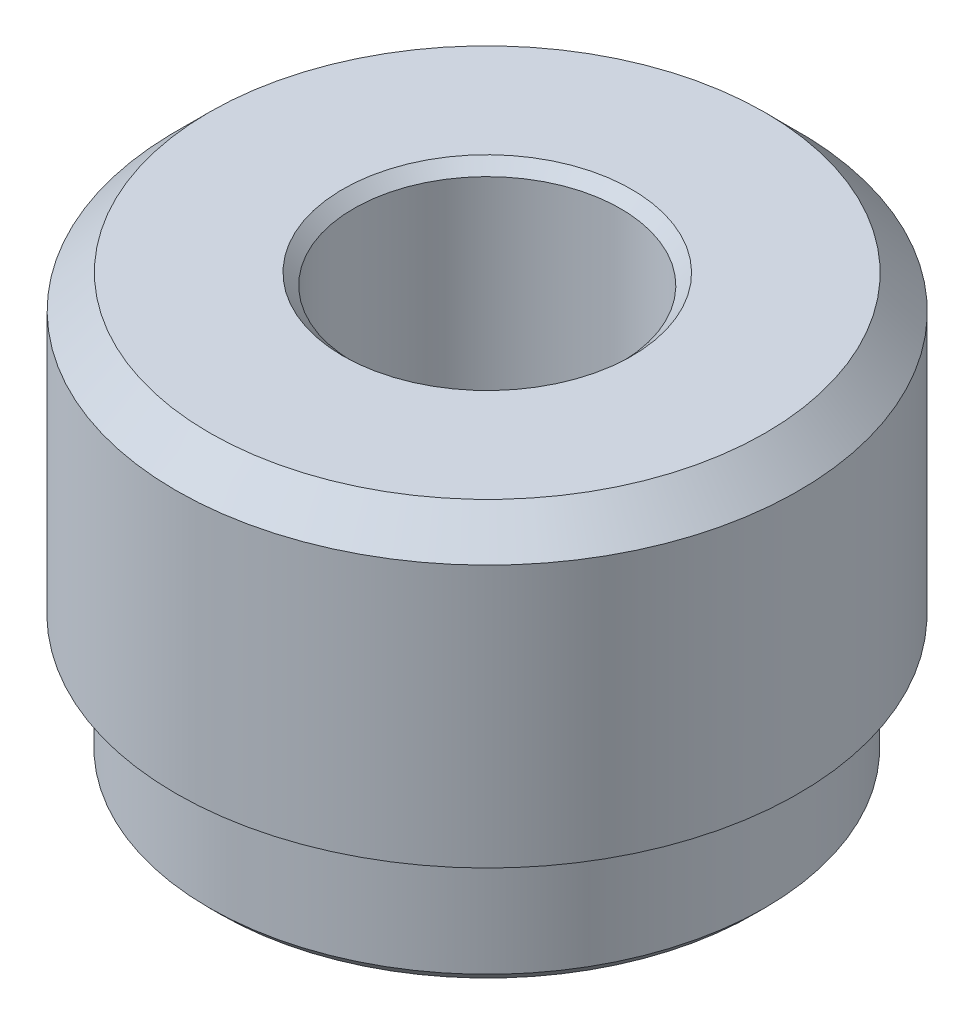
ISO-10303-21;
HEADER;
FILE_DESCRIPTION(('STEP AP214'),'2;1');
FILE_NAME('part.step','',(''),(''),'','','');
FILE_SCHEMA(('AUTOMOTIVE_DESIGN { 1 0 10303 214 1 1 1 1 }'));
ENDSEC;
DATA;
#1=APPLICATION_CONTEXT('core data for automotive mechanical design processes');
#2=APPLICATION_PROTOCOL_DEFINITION('international standard','automotive_design',2000,#1);
#3=PRODUCT_CONTEXT('',#1,'mechanical');
#4=PRODUCT('Part','Part','',(#3));
#5=PRODUCT_RELATED_PRODUCT_CATEGORY('part','',(#4));
#6=PRODUCT_DEFINITION_FORMATION('','',#4);
#7=PRODUCT_DEFINITION_CONTEXT('part definition',#1,'design');
#8=PRODUCT_DEFINITION('design','',#6,#7);
#9=PRODUCT_DEFINITION_SHAPE('','',#8);
#10=(LENGTH_UNIT() NAMED_UNIT(*) SI_UNIT(.MILLI.,.METRE.));
#11=(NAMED_UNIT(*) PLANE_ANGLE_UNIT() SI_UNIT($,.RADIAN.));
#12=(NAMED_UNIT(*) SI_UNIT($,.STERADIAN.) SOLID_ANGLE_UNIT());
#13=UNCERTAINTY_MEASURE_WITH_UNIT(LENGTH_MEASURE(1.E-05),#10,'distance_accuracy_value','');
#14=(GEOMETRIC_REPRESENTATION_CONTEXT(3) GLOBAL_UNCERTAINTY_ASSIGNED_CONTEXT((#13)) GLOBAL_UNIT_ASSIGNED_CONTEXT((#10,
#11,#12)) REPRESENTATION_CONTEXT('',''));
#15=CARTESIAN_POINT('',(0.,0.,0.));
#16=DIRECTION('',(0.,0.,1.));
#17=DIRECTION('',(1.,0.,0.));
#18=AXIS2_PLACEMENT_3D('',#15,#16,#17);
#19=CARTESIAN_POINT('',(2204.90020336715,599.510780212865,739.511565297236));
#20=DIRECTION('',(-0.000464480389083341,-0.999999608718792,0.000752874645300868));
#21=DIRECTION('',(0.,-0.000752874726514234,-0.999999716589783));
#22=AXIS2_PLACEMENT_3D('',#19,#20,#21);
#23=PLANE('',#22);
#24=CARTESIAN_POINT('',(2192.89997258563,599.516354083749,739.511561100809));
#25=DIRECTION('',(0.000464480389083341,0.999999608718792,-0.000752874645300868));
#26=DIRECTION('',(0.,0.000752874726514234,0.999999716589783));
#27=AXIS2_PLACEMENT_3D('',#24,#25,#26);
#28=CIRCLE('',#27,6.50023239960781);
#29=CARTESIAN_POINT('',(2192.89997258563,599.521247944439,746.011791658184));
#30=VERTEX_POINT('',#29);
#31=EDGE_CURVE('E65',#30,#30,#28,.T.);
#32=ORIENTED_EDGE('',*,*,#31,.T.);
#33=EDGE_LOOP('',(#32));
#34=FACE_BOUND('',#33,.T.);
#35=CARTESIAN_POINT('',(2192.89997258563,599.516354083749,739.511561100809));
#36=DIRECTION('',(0.000464480389083341,0.999999608718792,-0.000752874645300868));
#37=DIRECTION('',(0.,0.000752874726514234,0.999999716589783));
#38=AXIS2_PLACEMENT_3D('',#35,#36,#37);
#39=CIRCLE('',#38,12.0002320759932);
#40=CARTESIAN_POINT('',(2192.89997258563,599.525388755191,751.511789775813));
#41=VERTEX_POINT('',#40);
#42=EDGE_CURVE('E10',#41,#41,#39,.T.);
#43=ORIENTED_EDGE('',*,*,#42,.F.);
#44=EDGE_LOOP('',(#43));
#45=FACE_BOUND('',#44,.T.);
#46=ADVANCED_FACE('F31',(#34,#45),#23,.T.);
#47=CARTESIAN_POINT('',(2192.90020471803,600.016121809711,739.511184838212));
#48=DIRECTION('',(0.000464480389083341,0.999999608718792,-0.000752874645300868));
#49=DIRECTION('',(0.,0.000752874726514234,0.999999716589783));
#50=AXIS2_PLACEMENT_3D('',#47,#48,#49);
#51=CONICAL_SURFACE('',#50,12.4999999975059,0.785398163397605);
#52=ORIENTED_EDGE('',*,*,#42,.T.);
#53=EDGE_LOOP('',(#52));
#54=FACE_BOUND('',#53,.T.);
#55=CARTESIAN_POINT('',(2192.90020471803,600.016121809711,739.511184838212));
#56=DIRECTION('',(0.000464480389083341,0.999999608718792,-0.000752874645300868));
#57=DIRECTION('',(0.,0.000752874726514234,0.999999716589783));
#58=AXIS2_PLACEMENT_3D('',#55,#56,#57);
#59=CIRCLE('',#58,12.4999999975057);
#60=CARTESIAN_POINT('',(2192.90020471803,600.025532743791,752.01118129309));
#61=VERTEX_POINT('',#60);
#62=EDGE_CURVE('E37',#61,#61,#59,.T.);
#63=ORIENTED_EDGE('',*,*,#62,.F.);
#64=EDGE_LOOP('',(#63));
#65=FACE_BOUND('',#64,.T.);
#66=ADVANCED_FACE('F83',(#54,#65),#51,.T.);
#67=CARTESIAN_POINT('',(2192.89997005404,599.510903708627,739.511565204259));
#68=DIRECTION('',(0.000464480389083341,0.999999608718792,-0.000752874645300868));
#69=DIRECTION('',(0.,0.000752874726514234,0.999999716589783));
#70=AXIS2_PLACEMENT_3D('',#67,#68,#69);
#71=CYLINDRICAL_SURFACE('',#70,12.4999999975059);
#72=ORIENTED_EDGE('',*,*,#62,.T.);
#73=EDGE_LOOP('',(#72));
#74=FACE_BOUND('',#73,.T.);
#75=CARTESIAN_POINT('',(2192.90262012385,605.216351853446,739.50726971533));
#76=DIRECTION('',(0.000464480389083341,0.999999608718792,-0.000752874645300868));
#77=DIRECTION('',(0.,0.000752874726514234,0.999999716589783));
#78=AXIS2_PLACEMENT_3D('',#75,#76,#77);
#79=CIRCLE('',#78,12.4999999975059);
#80=CARTESIAN_POINT('',(2192.90262012385,605.225762787525,752.007266170208));
#81=VERTEX_POINT('',#80);
#82=EDGE_CURVE('E41',#81,#81,#79,.T.);
#83=ORIENTED_EDGE('',*,*,#82,.F.);
#84=EDGE_LOOP('',(#83));
#85=FACE_BOUND('',#84,.T.);
#86=ADVANCED_FACE('F87',(#74,#85),#71,.T.);
#87=CARTESIAN_POINT('',(2206.90261861365,605.209849129842,739.507274611068));
#88=DIRECTION('',(-0.000464480389083341,-0.999999608718792,0.000752874645300868));
#89=DIRECTION('',(0.,-0.000752874726514234,-0.999999716589783));
#90=AXIS2_PLACEMENT_3D('',#87,#88,#89);
#91=PLANE('',#90);
#92=ORIENTED_EDGE('',*,*,#82,.T.);
#93=EDGE_LOOP('',(#92));
#94=FACE_BOUND('',#93,.T.);
#95=CARTESIAN_POINT('',(2192.90262012385,605.216351853446,739.50726971533));
#96=DIRECTION('',(0.000464480389083341,0.999999608718792,-0.000752874645300868));
#97=DIRECTION('',(0.,0.000752874726514234,0.999999716589783));
#98=AXIS2_PLACEMENT_3D('',#95,#96,#97);
#99=CIRCLE('',#98,13.9999999999999);
#100=CARTESIAN_POINT('',(2192.90262012385,605.226892099617,753.507265747587));
#101=VERTEX_POINT('',#100);
#102=EDGE_CURVE('E45',#101,#101,#99,.T.);
#103=ORIENTED_EDGE('',*,*,#102,.F.);
#104=EDGE_LOOP('',(#103));
#105=FACE_BOUND('',#104,.T.);
#106=ADVANCED_FACE('F91',(#94,#105),#91,.T.);
#107=CARTESIAN_POINT('',(2192.89997005404,599.510903708627,739.511565204259));
#108=DIRECTION('',(0.000464480389083341,0.999999608718792,-0.000752874645300868));
#109=DIRECTION('',(0.,0.000752874726514234,0.999999716589783));
#110=AXIS2_PLACEMENT_3D('',#107,#108,#109);
#111=CYLINDRICAL_SURFACE('',#110,13.9999999999999);
#112=ORIENTED_EDGE('',*,*,#102,.T.);
#113=EDGE_LOOP('',(#112));
#114=FACE_BOUND('',#113,.T.);
#115=CARTESIAN_POINT('',(2192.9081006686,617.015650030296,739.498386319425));
#116=DIRECTION('',(0.000464480389083341,0.999999608718792,-0.000752874645300868));
#117=DIRECTION('',(0.,0.000752874726514234,0.999999716589783));
#118=AXIS2_PLACEMENT_3D('',#115,#116,#117);
#119=CIRCLE('',#118,14.0000000000001);
#120=CARTESIAN_POINT('',(2192.9081006686,617.026190276468,753.498382351682));
#121=VERTEX_POINT('',#120);
#122=EDGE_CURVE('E50',#121,#121,#119,.T.);
#123=ORIENTED_EDGE('',*,*,#122,.F.);
#124=EDGE_LOOP('',(#123));
#125=FACE_BOUND('',#124,.T.);
#126=ADVANCED_FACE('F97',(#114,#125),#111,.T.);
#127=CARTESIAN_POINT('',(2192.90879771302,618.516346649406,739.497256482548));
#128=DIRECTION('',(-0.000464480389083341,-0.999999608718792,0.000752874645300868));
#129=DIRECTION('',(0.,-0.000752874726514234,-0.999999716589783));
#130=AXIS2_PLACEMENT_3D('',#127,#128,#129);
#131=CONICAL_SURFACE('',#130,12.4993027936959,0.785398163397418);
#132=ORIENTED_EDGE('',*,*,#122,.T.);
#133=EDGE_LOOP('',(#132));
#134=FACE_BOUND('',#133,.T.);
#135=CARTESIAN_POINT('',(2192.90879771302,618.516346649406,739.497256482548));
#136=DIRECTION('',(0.000464480389083341,0.999999608718792,-0.000752874645300868));
#137=DIRECTION('',(0.,0.000752874726514234,0.999999716589783));
#138=AXIS2_PLACEMENT_3D('',#135,#136,#137);
#139=CIRCLE('',#138,12.499302793696);
#140=CARTESIAN_POINT('',(2192.90879771302,618.525757058578,751.996555733814));
#141=VERTEX_POINT('',#140);
#142=EDGE_CURVE('E53',#141,#141,#139,.T.);
#143=ORIENTED_EDGE('',*,*,#142,.F.);
#144=EDGE_LOOP('',(#143));
#145=FACE_BOUND('',#144,.T.);
#146=ADVANCED_FACE('F101',(#134,#145),#131,.T.);
#147=CARTESIAN_POINT('',(2199.40856493091,618.51332763553,739.497258755488));
#148=DIRECTION('',(0.000464480389083341,0.999999608718792,-0.000752874645300868));
#149=DIRECTION('',(0.,0.000752874726514234,0.999999716589783));
#150=AXIS2_PLACEMENT_3D('',#147,#148,#149);
#151=PLANE('',#150);
#152=ORIENTED_EDGE('',*,*,#142,.T.);
#153=EDGE_LOOP('',(#152));
#154=FACE_BOUND('',#153,.T.);
#155=CARTESIAN_POINT('',(2192.90879771302,618.516346649406,739.497256482548));
#156=DIRECTION('',(0.000464480389083341,0.999999608718792,-0.000752874645300868));
#157=DIRECTION('',(0.,0.000752874726514234,0.999999716589783));
#158=AXIS2_PLACEMENT_3D('',#155,#156,#157);
#159=CIRCLE('',#158,6.49976791901951);
#160=CARTESIAN_POINT('',(2192.90879771302,618.5212401604,745.997022559467));
#161=VERTEX_POINT('',#160);
#162=EDGE_CURVE('E56',#161,#161,#159,.T.);
#163=ORIENTED_EDGE('',*,*,#162,.F.);
#164=EDGE_LOOP('',(#163));
#165=FACE_BOUND('',#164,.T.);
#166=ADVANCED_FACE('F105',(#154,#165),#151,.T.);
#167=CARTESIAN_POINT('',(2192.90856558063,618.016578923444,739.497632745144));
#168=DIRECTION('',(0.000464480389083341,0.999999608718792,-0.000752874645300868));
#169=DIRECTION('',(0.,0.000752874726514234,0.999999716589783));
#170=AXIS2_PLACEMENT_3D('',#167,#168,#169);
#171=CONICAL_SURFACE('',#170,5.99999999750741,0.785398163397606);
#172=ORIENTED_EDGE('',*,*,#162,.T.);
#173=EDGE_LOOP('',(#172));
#174=FACE_BOUND('',#173,.T.);
#175=CARTESIAN_POINT('',(2192.90856558063,618.016578923444,739.497632745144));
#176=DIRECTION('',(0.000464480389083341,0.999999608718792,-0.000752874645300868));
#177=DIRECTION('',(0.,0.000752874726514234,0.999999716589783));
#178=AXIS2_PLACEMENT_3D('',#175,#176,#177);
#179=CIRCLE('',#178,5.9999999975075);
#180=CARTESIAN_POINT('',(2192.90856558063,618.021096171801,745.497631042191));
#181=VERTEX_POINT('',#180);
#182=EDGE_CURVE('E59',#181,#181,#179,.T.);
#183=ORIENTED_EDGE('',*,*,#182,.F.);
#184=EDGE_LOOP('',(#183));
#185=FACE_BOUND('',#184,.T.);
#186=ADVANCED_FACE('F79',(#174,#185),#171,.F.);
#187=CARTESIAN_POINT('',(2192.89997005404,599.510903708627,739.511565204259));
#188=DIRECTION('',(0.000464480389083341,0.999999608718792,-0.000752874645300868));
#189=DIRECTION('',(0.,0.000752874726514234,0.999999716589783));
#190=AXIS2_PLACEMENT_3D('',#187,#188,#189);
#191=CYLINDRICAL_SURFACE('',#190,5.99999999750719);
#192=ORIENTED_EDGE('',*,*,#182,.T.);
#193=EDGE_LOOP('',(#192));
#194=FACE_BOUND('',#193,.T.);
#195=CARTESIAN_POINT('',(2192.90020493377,600.016586290119,739.511184488516));
#196=DIRECTION('',(0.000464480389083341,0.999999608718792,-0.000752874645300868));
#197=DIRECTION('',(0.,0.000752874726514234,0.999999716589783));
#198=AXIS2_PLACEMENT_3D('',#195,#196,#197);
#199=CIRCLE('',#198,5.99999999750719);
#200=CARTESIAN_POINT('',(2192.90020493377,600.021103538476,745.511182785562));
#201=VERTEX_POINT('',#200);
#202=EDGE_CURVE('E62',#201,#201,#199,.T.);
#203=ORIENTED_EDGE('',*,*,#202,.F.);
#204=EDGE_LOOP('',(#203));
#205=FACE_BOUND('',#204,.T.);
#206=ADVANCED_FACE('F73',(#194,#205),#191,.F.);
#207=CARTESIAN_POINT('',(2192.89997258563,599.516354083749,739.511561100809));
#208=DIRECTION('',(-0.000464480389083341,-0.999999608718792,0.000752874645300868));
#209=DIRECTION('',(0.,-0.000752874726514234,-0.999999716589783));
#210=AXIS2_PLACEMENT_3D('',#207,#208,#209);
#211=CONICAL_SURFACE('',#210,6.500232399608,0.785398163397308);
#212=ORIENTED_EDGE('',*,*,#202,.T.);
#213=EDGE_LOOP('',(#212));
#214=FACE_BOUND('',#213,.T.);
#215=ORIENTED_EDGE('',*,*,#31,.F.);
#216=EDGE_LOOP('',(#215));
#217=FACE_BOUND('',#216,.T.);
#218=ADVANCED_FACE('F71',(#214,#217),#211,.F.);
#219=CLOSED_SHELL('',(#46,#66,#86,#106,#126,#146,#166,#186,#206,#218));
#220=MANIFOLD_SOLID_BREP('B2',#219);
#221=ADVANCED_BREP_SHAPE_REPRESENTATION('',(#18,#220),#14);
#222=SHAPE_DEFINITION_REPRESENTATION(#9,#221);
ENDSEC;
END-ISO-10303-21;
